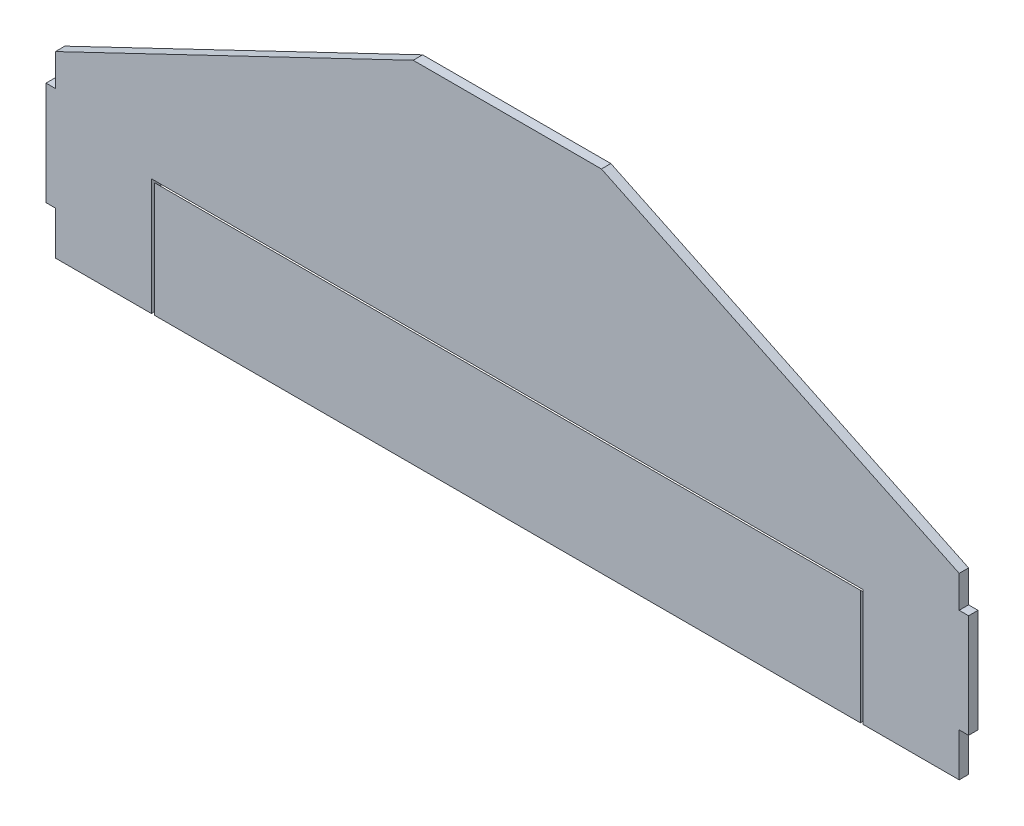
ISO-10303-21;
HEADER;
FILE_DESCRIPTION(('STEP AP214'),'2;1');
FILE_NAME('part.step','',(''),(''),'','','');
FILE_SCHEMA(('AUTOMOTIVE_DESIGN { 1 0 10303 214 1 1 1 1 }'));
ENDSEC;
DATA;
#1=APPLICATION_CONTEXT('core data for automotive mechanical design processes');
#2=APPLICATION_PROTOCOL_DEFINITION('international standard','automotive_design',2000,#1);
#3=PRODUCT_CONTEXT('',#1,'mechanical');
#4=PRODUCT('Part','Part','',(#3));
#5=PRODUCT_RELATED_PRODUCT_CATEGORY('part','',(#4));
#6=PRODUCT_DEFINITION_FORMATION('','',#4);
#7=PRODUCT_DEFINITION_CONTEXT('part definition',#1,'design');
#8=PRODUCT_DEFINITION('design','',#6,#7);
#9=PRODUCT_DEFINITION_SHAPE('','',#8);
#10=(LENGTH_UNIT() NAMED_UNIT(*) SI_UNIT(.MILLI.,.METRE.));
#11=(NAMED_UNIT(*) PLANE_ANGLE_UNIT() SI_UNIT($,.RADIAN.));
#12=(NAMED_UNIT(*) SI_UNIT($,.STERADIAN.) SOLID_ANGLE_UNIT());
#13=UNCERTAINTY_MEASURE_WITH_UNIT(LENGTH_MEASURE(1.E-05),#10,'distance_accuracy_value','');
#14=(GEOMETRIC_REPRESENTATION_CONTEXT(3) GLOBAL_UNCERTAINTY_ASSIGNED_CONTEXT((#13)) GLOBAL_UNIT_ASSIGNED_CONTEXT((#10,
#11,#12)) REPRESENTATION_CONTEXT('',''));
#15=CARTESIAN_POINT('',(0.,0.,0.));
#16=DIRECTION('',(0.,0.,1.));
#17=DIRECTION('',(1.,0.,0.));
#18=AXIS2_PLACEMENT_3D('',#15,#16,#17);
#19=CARTESIAN_POINT('',(240.,0.,5.));
#20=DIRECTION('',(0.,1.,0.));
#21=DIRECTION('',(0.,0.,1.));
#22=AXIS2_PLACEMENT_3D('',#19,#20,#21);
#23=PLANE('',#22);
#24=DIRECTION('',(1.,0.,0.));
#25=VECTOR('',#24,1.);
#26=CARTESIAN_POINT('',(240.,0.,5.));
#27=LINE('',#26,#25);
#28=CARTESIAN_POINT('',(189.,0.,5.));
#29=VERTEX_POINT('',#28);
#30=CARTESIAN_POINT('',(240.,0.,5.));
#31=VERTEX_POINT('',#30);
#32=EDGE_CURVE('E232',#29,#31,#27,.T.);
#33=ORIENTED_EDGE('',*,*,#32,.F.);
#34=DIRECTION('',(0.,0.,1.));
#35=VECTOR('',#34,1.);
#36=CARTESIAN_POINT('',(189.,0.,0.));
#37=LINE('',#36,#35);
#38=CARTESIAN_POINT('',(189.,0.,0.));
#39=VERTEX_POINT('',#38);
#40=EDGE_CURVE('E12',#39,#29,#37,.T.);
#41=ORIENTED_EDGE('',*,*,#40,.F.);
#42=DIRECTION('',(1.,0.,0.));
#43=VECTOR('',#42,1.);
#44=CARTESIAN_POINT('',(240.,0.,0.));
#45=LINE('',#44,#43);
#46=CARTESIAN_POINT('',(240.,0.,0.));
#47=VERTEX_POINT('',#46);
#48=EDGE_CURVE('E278',#39,#47,#45,.T.);
#49=ORIENTED_EDGE('',*,*,#48,.T.);
#50=DIRECTION('',(0.,0.,-1.));
#51=VECTOR('',#50,1.);
#52=CARTESIAN_POINT('',(240.,0.,5.));
#53=LINE('',#52,#51);
#54=EDGE_CURVE('E244',#31,#47,#53,.T.);
#55=ORIENTED_EDGE('',*,*,#54,.F.);
#56=EDGE_LOOP('',(#33,#41,#49,#55));
#57=FACE_BOUND('',#56,.T.);
#58=ADVANCED_FACE('F43',(#57),#23,.F.);
#59=CARTESIAN_POINT('',(-240.,0.,0.));
#60=VERTEX_POINT('',#59);
#61=CARTESIAN_POINT('',(-189.,0.,0.));
#62=VERTEX_POINT('',#61);
#63=EDGE_CURVE('E46',#60,#62,#45,.T.);
#64=ORIENTED_EDGE('',*,*,#63,.T.);
#65=DIRECTION('',(0.,0.,1.));
#66=VECTOR('',#65,1.);
#67=CARTESIAN_POINT('',(-189.,0.,0.));
#68=LINE('',#67,#66);
#69=CARTESIAN_POINT('',(-189.,0.,5.));
#70=VERTEX_POINT('',#69);
#71=EDGE_CURVE('E213',#62,#70,#68,.T.);
#72=ORIENTED_EDGE('',*,*,#71,.T.);
#73=CARTESIAN_POINT('',(-240.,0.,5.));
#74=VERTEX_POINT('',#73);
#75=EDGE_CURVE('E231',#74,#70,#27,.T.);
#76=ORIENTED_EDGE('',*,*,#75,.F.);
#77=DIRECTION('',(0.,0.,-1.));
#78=VECTOR('',#77,1.);
#79=CARTESIAN_POINT('',(-240.,0.,5.));
#80=LINE('',#79,#78);
#81=EDGE_CURVE('E215',#74,#60,#80,.T.);
#82=ORIENTED_EDGE('',*,*,#81,.T.);
#83=EDGE_LOOP('',(#64,#72,#76,#82));
#84=FACE_BOUND('',#83,.T.);
#85=ADVANCED_FACE('F366',(#84),#23,.F.);
#86=CARTESIAN_POINT('',(0.,0.,5.));
#87=DIRECTION('',(0.,0.,-1.));
#88=DIRECTION('',(-1.,0.,0.));
#89=AXIS2_PLACEMENT_3D('',#86,#87,#88);
#90=PLANE('',#89);
#91=ORIENTED_EDGE('',*,*,#75,.T.);
#92=DIRECTION('',(0.,-1.,0.));
#93=VECTOR('',#92,1.);
#94=CARTESIAN_POINT('',(-189.,0.,5.));
#95=LINE('',#94,#93);
#96=CARTESIAN_POINT('',(-189.,62.,5.));
#97=VERTEX_POINT('',#96);
#98=EDGE_CURVE('E222',#97,#70,#95,.T.);
#99=ORIENTED_EDGE('',*,*,#98,.F.);
#100=DIRECTION('',(-1.,0.,0.));
#101=VECTOR('',#100,1.);
#102=CARTESIAN_POINT('',(-187.5,62.,5.));
#103=LINE('',#102,#101);
#104=CARTESIAN_POINT('',(189.,62.,5.));
#105=VERTEX_POINT('',#104);
#106=EDGE_CURVE('E220',#105,#97,#103,.T.);
#107=ORIENTED_EDGE('',*,*,#106,.F.);
#108=DIRECTION('',(0.,1.,0.));
#109=VECTOR('',#108,1.);
#110=CARTESIAN_POINT('',(189.,0.,5.));
#111=LINE('',#110,#109);
#112=EDGE_CURVE('E52',#29,#105,#111,.T.);
#113=ORIENTED_EDGE('',*,*,#112,.F.);
#114=ORIENTED_EDGE('',*,*,#32,.T.);
#115=DIRECTION('',(0.,1.,0.));
#116=VECTOR('',#115,1.);
#117=CARTESIAN_POINT('',(240.,0.,5.));
#118=LINE('',#117,#116);
#119=CARTESIAN_POINT('',(240.,23.,5.));
#120=VERTEX_POINT('',#119);
#121=EDGE_CURVE('E235',#31,#120,#118,.T.);
#122=ORIENTED_EDGE('',*,*,#121,.T.);
#123=DIRECTION('',(1.,0.,0.));
#124=VECTOR('',#123,1.);
#125=CARTESIAN_POINT('',(240.,23.,5.));
#126=LINE('',#125,#124);
#127=CARTESIAN_POINT('',(245.,23.,5.));
#128=VERTEX_POINT('',#127);
#129=EDGE_CURVE('E297',#120,#128,#126,.T.);
#130=ORIENTED_EDGE('',*,*,#129,.T.);
#131=DIRECTION('',(0.,1.,0.));
#132=VECTOR('',#131,1.);
#133=CARTESIAN_POINT('',(245.,78.,5.));
#134=LINE('',#133,#132);
#135=CARTESIAN_POINT('',(245.,78.,5.));
#136=VERTEX_POINT('',#135);
#137=EDGE_CURVE('E301',#128,#136,#134,.T.);
#138=ORIENTED_EDGE('',*,*,#137,.T.);
#139=DIRECTION('',(-1.,0.,0.));
#140=VECTOR('',#139,1.);
#141=CARTESIAN_POINT('',(240.,78.,5.));
#142=LINE('',#141,#140);
#143=CARTESIAN_POINT('',(240.,78.,5.));
#144=VERTEX_POINT('',#143);
#145=EDGE_CURVE('E305',#136,#144,#142,.T.);
#146=ORIENTED_EDGE('',*,*,#145,.T.);
#147=CARTESIAN_POINT('',(240.,95.,5.));
#148=VERTEX_POINT('',#147);
#149=EDGE_CURVE('E300',#144,#148,#118,.T.);
#150=ORIENTED_EDGE('',*,*,#149,.T.);
#151=DIRECTION('',(-0.90189308923433,0.431959321685916,0.));
#152=VECTOR('',#151,1.);
#153=CARTESIAN_POINT('',(240.,95.,5.));
#154=LINE('',#153,#152);
#155=CARTESIAN_POINT('',(50.,186.,5.));
#156=VERTEX_POINT('',#155);
#157=EDGE_CURVE('E304',#148,#156,#154,.T.);
#158=ORIENTED_EDGE('',*,*,#157,.T.);
#159=DIRECTION('',(-1.,0.,0.));
#160=VECTOR('',#159,1.);
#161=CARTESIAN_POINT('',(-50.,186.,5.));
#162=LINE('',#161,#160);
#163=CARTESIAN_POINT('',(-50.,186.,5.));
#164=VERTEX_POINT('',#163);
#165=EDGE_CURVE('E198',#156,#164,#162,.T.);
#166=ORIENTED_EDGE('',*,*,#165,.T.);
#167=DIRECTION('',(-0.90189308923433,-0.431959321685916,0.));
#168=VECTOR('',#167,1.);
#169=CARTESIAN_POINT('',(-240.,95.,5.));
#170=LINE('',#169,#168);
#171=CARTESIAN_POINT('',(-240.,95.,5.));
#172=VERTEX_POINT('',#171);
#173=EDGE_CURVE('E194',#164,#172,#170,.T.);
#174=ORIENTED_EDGE('',*,*,#173,.T.);
#175=DIRECTION('',(0.,-1.,0.));
#176=VECTOR('',#175,1.);
#177=CARTESIAN_POINT('',(-240.,0.,5.));
#178=LINE('',#177,#176);
#179=CARTESIAN_POINT('',(-240.,78.,5.));
#180=VERTEX_POINT('',#179);
#181=EDGE_CURVE('E181',#172,#180,#178,.T.);
#182=ORIENTED_EDGE('',*,*,#181,.T.);
#183=DIRECTION('',(-1.,0.,0.));
#184=VECTOR('',#183,1.);
#185=CARTESIAN_POINT('',(-240.,78.,5.));
#186=LINE('',#185,#184);
#187=CARTESIAN_POINT('',(-245.,78.,5.));
#188=VERTEX_POINT('',#187);
#189=EDGE_CURVE('E168',#180,#188,#186,.T.);
#190=ORIENTED_EDGE('',*,*,#189,.T.);
#191=DIRECTION('',(0.,-1.,0.));
#192=VECTOR('',#191,1.);
#193=CARTESIAN_POINT('',(-245.,78.,5.));
#194=LINE('',#193,#192);
#195=CARTESIAN_POINT('',(-245.,23.,5.));
#196=VERTEX_POINT('',#195);
#197=EDGE_CURVE('E180',#188,#196,#194,.T.);
#198=ORIENTED_EDGE('',*,*,#197,.T.);
#199=DIRECTION('',(1.,0.,0.));
#200=VECTOR('',#199,1.);
#201=CARTESIAN_POINT('',(-240.,23.,5.));
#202=LINE('',#201,#200);
#203=CARTESIAN_POINT('',(-240.,23.,5.));
#204=VERTEX_POINT('',#203);
#205=EDGE_CURVE('E202',#196,#204,#202,.T.);
#206=ORIENTED_EDGE('',*,*,#205,.T.);
#207=EDGE_CURVE('E197',#204,#74,#178,.T.);
#208=ORIENTED_EDGE('',*,*,#207,.T.);
#209=EDGE_LOOP('',(#91,#99,#107,#113,#114,#122,#130,#138,#146,#150,#158,#166,#174,#182,#190,
#198,#206,#208));
#210=FACE_BOUND('',#209,.T.);
#211=ADVANCED_FACE('F192',(#210),#90,.F.);
#212=CARTESIAN_POINT('',(0.,0.,0.));
#213=DIRECTION('',(0.,0.,-1.));
#214=DIRECTION('',(-1.,0.,0.));
#215=AXIS2_PLACEMENT_3D('',#212,#213,#214);
#216=PLANE('',#215);
#217=DIRECTION('',(0.,-1.,0.));
#218=VECTOR('',#217,1.);
#219=CARTESIAN_POINT('',(-189.,0.,0.));
#220=LINE('',#219,#218);
#221=CARTESIAN_POINT('',(-189.,62.,0.));
#222=VERTEX_POINT('',#221);
#223=EDGE_CURVE('E201',#222,#62,#220,.T.);
#224=ORIENTED_EDGE('',*,*,#223,.T.);
#225=ORIENTED_EDGE('',*,*,#63,.F.);
#226=DIRECTION('',(0.,-1.,0.));
#227=VECTOR('',#226,1.);
#228=CARTESIAN_POINT('',(-240.,0.,0.));
#229=LINE('',#228,#227);
#230=CARTESIAN_POINT('',(-240.,23.,0.));
#231=VERTEX_POINT('',#230);
#232=EDGE_CURVE('E229',#231,#60,#229,.T.);
#233=ORIENTED_EDGE('',*,*,#232,.F.);
#234=DIRECTION('',(1.,0.,0.));
#235=VECTOR('',#234,1.);
#236=CARTESIAN_POINT('',(-240.,23.,0.));
#237=LINE('',#236,#235);
#238=CARTESIAN_POINT('',(-245.,23.,0.));
#239=VERTEX_POINT('',#238);
#240=EDGE_CURVE('E276',#239,#231,#237,.T.);
#241=ORIENTED_EDGE('',*,*,#240,.F.);
#242=DIRECTION('',(0.,-1.,0.));
#243=VECTOR('',#242,1.);
#244=CARTESIAN_POINT('',(-245.,78.,0.));
#245=LINE('',#244,#243);
#246=CARTESIAN_POINT('',(-245.,78.,0.));
#247=VERTEX_POINT('',#246);
#248=EDGE_CURVE('E317',#247,#239,#245,.T.);
#249=ORIENTED_EDGE('',*,*,#248,.F.);
#250=DIRECTION('',(-1.,0.,0.));
#251=VECTOR('',#250,1.);
#252=CARTESIAN_POINT('',(-240.,78.,0.));
#253=LINE('',#252,#251);
#254=CARTESIAN_POINT('',(-240.,78.,0.));
#255=VERTEX_POINT('',#254);
#256=EDGE_CURVE('E314',#255,#247,#253,.T.);
#257=ORIENTED_EDGE('',*,*,#256,.F.);
#258=CARTESIAN_POINT('',(-240.,95.,0.));
#259=VERTEX_POINT('',#258);
#260=EDGE_CURVE('E188',#259,#255,#229,.T.);
#261=ORIENTED_EDGE('',*,*,#260,.F.);
#262=DIRECTION('',(-0.90189308923433,-0.431959321685916,0.));
#263=VECTOR('',#262,1.);
#264=CARTESIAN_POINT('',(-240.,95.,0.));
#265=LINE('',#264,#263);
#266=CARTESIAN_POINT('',(-50.,186.,0.));
#267=VERTEX_POINT('',#266);
#268=EDGE_CURVE('E251',#267,#259,#265,.T.);
#269=ORIENTED_EDGE('',*,*,#268,.F.);
#270=DIRECTION('',(-1.,0.,0.));
#271=VECTOR('',#270,1.);
#272=CARTESIAN_POINT('',(-50.,186.,0.));
#273=LINE('',#272,#271);
#274=CARTESIAN_POINT('',(50.,186.,0.));
#275=VERTEX_POINT('',#274);
#276=EDGE_CURVE('E254',#275,#267,#273,.T.);
#277=ORIENTED_EDGE('',*,*,#276,.F.);
#278=DIRECTION('',(-0.90189308923433,0.431959321685916,0.));
#279=VECTOR('',#278,1.);
#280=CARTESIAN_POINT('',(240.,95.,0.));
#281=LINE('',#280,#279);
#282=CARTESIAN_POINT('',(240.,95.,0.));
#283=VERTEX_POINT('',#282);
#284=EDGE_CURVE('E247',#283,#275,#281,.T.);
#285=ORIENTED_EDGE('',*,*,#284,.F.);
#286=DIRECTION('',(0.,1.,0.));
#287=VECTOR('',#286,1.);
#288=CARTESIAN_POINT('',(240.,0.,0.));
#289=LINE('',#288,#287);
#290=CARTESIAN_POINT('',(240.,78.,0.));
#291=VERTEX_POINT('',#290);
#292=EDGE_CURVE('E259',#291,#283,#289,.T.);
#293=ORIENTED_EDGE('',*,*,#292,.F.);
#294=DIRECTION('',(-1.,0.,0.));
#295=VECTOR('',#294,1.);
#296=CARTESIAN_POINT('',(240.,78.,0.));
#297=LINE('',#296,#295);
#298=CARTESIAN_POINT('',(245.,78.,0.));
#299=VERTEX_POINT('',#298);
#300=EDGE_CURVE('E324',#299,#291,#297,.T.);
#301=ORIENTED_EDGE('',*,*,#300,.F.);
#302=DIRECTION('',(0.,1.,0.));
#303=VECTOR('',#302,1.);
#304=CARTESIAN_POINT('',(245.,78.,0.));
#305=LINE('',#304,#303);
#306=CARTESIAN_POINT('',(245.,23.,0.));
#307=VERTEX_POINT('',#306);
#308=EDGE_CURVE('E290',#307,#299,#305,.T.);
#309=ORIENTED_EDGE('',*,*,#308,.F.);
#310=DIRECTION('',(1.,0.,0.));
#311=VECTOR('',#310,1.);
#312=CARTESIAN_POINT('',(240.,23.,0.));
#313=LINE('',#312,#311);
#314=CARTESIAN_POINT('',(240.,23.,0.));
#315=VERTEX_POINT('',#314);
#316=EDGE_CURVE('E287',#315,#307,#313,.T.);
#317=ORIENTED_EDGE('',*,*,#316,.F.);
#318=EDGE_CURVE('E257',#47,#315,#289,.T.);
#319=ORIENTED_EDGE('',*,*,#318,.F.);
#320=ORIENTED_EDGE('',*,*,#48,.F.);
#321=DIRECTION('',(0.,1.,0.));
#322=VECTOR('',#321,1.);
#323=CARTESIAN_POINT('',(189.,0.,0.));
#324=LINE('',#323,#322);
#325=CARTESIAN_POINT('',(189.,62.,0.));
#326=VERTEX_POINT('',#325);
#327=EDGE_CURVE('E207',#39,#326,#324,.T.);
#328=ORIENTED_EDGE('',*,*,#327,.T.);
#329=DIRECTION('',(-1.,0.,0.));
#330=VECTOR('',#329,1.);
#331=CARTESIAN_POINT('',(187.5,62.,0.));
#332=LINE('',#331,#330);
#333=EDGE_CURVE('E226',#326,#222,#332,.T.);
#334=ORIENTED_EDGE('',*,*,#333,.T.);
#335=EDGE_LOOP('',(#224,#225,#233,#241,#249,#257,#261,#269,#277,#285,#293,#301,#309,#317,#319,
#320,#328,#334));
#336=FACE_BOUND('',#335,.T.);
#337=ADVANCED_FACE('F275',(#336),#216,.T.);
#338=CARTESIAN_POINT('',(-240.,0.,5.));
#339=DIRECTION('',(1.,0.,0.));
#340=DIRECTION('',(0.,1.,0.));
#341=AXIS2_PLACEMENT_3D('',#338,#339,#340);
#342=PLANE('',#341);
#343=DIRECTION('',(0.,0.,1.));
#344=VECTOR('',#343,1.);
#345=CARTESIAN_POINT('',(-240.,23.,-55.2268050859363));
#346=LINE('',#345,#344);
#347=EDGE_CURVE('E273',#231,#204,#346,.T.);
#348=ORIENTED_EDGE('',*,*,#347,.F.);
#349=ORIENTED_EDGE('',*,*,#232,.T.);
#350=ORIENTED_EDGE('',*,*,#81,.F.);
#351=ORIENTED_EDGE('',*,*,#207,.F.);
#352=EDGE_LOOP('',(#348,#349,#350,#351));
#353=FACE_BOUND('',#352,.T.);
#354=ADVANCED_FACE('F272',(#353),#342,.F.);
#355=CARTESIAN_POINT('',(240.,0.,5.));
#356=DIRECTION('',(-1.,0.,0.));
#357=DIRECTION('',(0.,-1.,0.));
#358=AXIS2_PLACEMENT_3D('',#355,#356,#357);
#359=PLANE('',#358);
#360=DIRECTION('',(0.,0.,1.));
#361=VECTOR('',#360,1.);
#362=CARTESIAN_POINT('',(240.,78.,-55.2268050859363));
#363=LINE('',#362,#361);
#364=EDGE_CURVE('E322',#291,#144,#363,.T.);
#365=ORIENTED_EDGE('',*,*,#364,.F.);
#366=ORIENTED_EDGE('',*,*,#292,.T.);
#367=DIRECTION('',(0.,0.,-1.));
#368=VECTOR('',#367,1.);
#369=CARTESIAN_POINT('',(240.,95.,5.));
#370=LINE('',#369,#368);
#371=EDGE_CURVE('E256',#148,#283,#370,.T.);
#372=ORIENTED_EDGE('',*,*,#371,.F.);
#373=ORIENTED_EDGE('',*,*,#149,.F.);
#374=EDGE_LOOP('',(#365,#366,#372,#373));
#375=FACE_BOUND('',#374,.T.);
#376=ADVANCED_FACE('F337',(#375),#359,.F.);
#377=ORIENTED_EDGE('',*,*,#318,.T.);
#378=DIRECTION('',(0.,0.,1.));
#379=VECTOR('',#378,1.);
#380=CARTESIAN_POINT('',(240.,23.,-55.2268050859363));
#381=LINE('',#380,#379);
#382=EDGE_CURVE('E248',#315,#120,#381,.T.);
#383=ORIENTED_EDGE('',*,*,#382,.T.);
#384=ORIENTED_EDGE('',*,*,#121,.F.);
#385=ORIENTED_EDGE('',*,*,#54,.T.);
#386=EDGE_LOOP('',(#377,#383,#384,#385));
#387=FACE_BOUND('',#386,.T.);
#388=ADVANCED_FACE('F284',(#387),#359,.F.);
#389=CARTESIAN_POINT('',(240.,95.,5.));
#390=DIRECTION('',(-0.431959321685916,-0.90189308923433,0.));
#391=DIRECTION('',(0.90189308923433,-0.431959321685916,0.));
#392=AXIS2_PLACEMENT_3D('',#389,#390,#391);
#393=PLANE('',#392);
#394=ORIENTED_EDGE('',*,*,#284,.T.);
#395=DIRECTION('',(0.,0.,-1.));
#396=VECTOR('',#395,1.);
#397=CARTESIAN_POINT('',(50.,186.,5.));
#398=LINE('',#397,#396);
#399=EDGE_CURVE('E253',#156,#275,#398,.T.);
#400=ORIENTED_EDGE('',*,*,#399,.F.);
#401=ORIENTED_EDGE('',*,*,#157,.F.);
#402=ORIENTED_EDGE('',*,*,#371,.T.);
#403=EDGE_LOOP('',(#394,#400,#401,#402));
#404=FACE_BOUND('',#403,.T.);
#405=ADVANCED_FACE('F344',(#404),#393,.F.);
#406=CARTESIAN_POINT('',(-50.,186.,5.));
#407=DIRECTION('',(0.,-1.,0.));
#408=DIRECTION('',(0.,0.,-1.));
#409=AXIS2_PLACEMENT_3D('',#406,#407,#408);
#410=PLANE('',#409);
#411=ORIENTED_EDGE('',*,*,#276,.T.);
#412=DIRECTION('',(0.,0.,-1.));
#413=VECTOR('',#412,1.);
#414=CARTESIAN_POINT('',(-50.,186.,5.));
#415=LINE('',#414,#413);
#416=EDGE_CURVE('E250',#164,#267,#415,.T.);
#417=ORIENTED_EDGE('',*,*,#416,.F.);
#418=ORIENTED_EDGE('',*,*,#165,.F.);
#419=ORIENTED_EDGE('',*,*,#399,.T.);
#420=EDGE_LOOP('',(#411,#417,#418,#419));
#421=FACE_BOUND('',#420,.T.);
#422=ADVANCED_FACE('F460',(#421),#410,.F.);
#423=CARTESIAN_POINT('',(-240.,95.,5.));
#424=DIRECTION('',(0.431959321685916,-0.90189308923433,0.));
#425=DIRECTION('',(0.90189308923433,0.431959321685916,0.));
#426=AXIS2_PLACEMENT_3D('',#423,#424,#425);
#427=PLANE('',#426);
#428=ORIENTED_EDGE('',*,*,#268,.T.);
#429=DIRECTION('',(0.,0.,-1.));
#430=VECTOR('',#429,1.);
#431=CARTESIAN_POINT('',(-240.,95.,5.));
#432=LINE('',#431,#430);
#433=EDGE_CURVE('E189',#172,#259,#432,.T.);
#434=ORIENTED_EDGE('',*,*,#433,.F.);
#435=ORIENTED_EDGE('',*,*,#173,.F.);
#436=ORIENTED_EDGE('',*,*,#416,.T.);
#437=EDGE_LOOP('',(#428,#434,#435,#436));
#438=FACE_BOUND('',#437,.T.);
#439=ADVANCED_FACE('F350',(#438),#427,.F.);
#440=ORIENTED_EDGE('',*,*,#260,.T.);
#441=DIRECTION('',(0.,0.,1.));
#442=VECTOR('',#441,1.);
#443=CARTESIAN_POINT('',(-240.,78.,-55.2268050859363));
#444=LINE('',#443,#442);
#445=EDGE_CURVE('E172',#255,#180,#444,.T.);
#446=ORIENTED_EDGE('',*,*,#445,.T.);
#447=ORIENTED_EDGE('',*,*,#181,.F.);
#448=ORIENTED_EDGE('',*,*,#433,.T.);
#449=EDGE_LOOP('',(#440,#446,#447,#448));
#450=FACE_BOUND('',#449,.T.);
#451=ADVANCED_FACE('F185',(#450),#342,.F.);
#452=CARTESIAN_POINT('',(240.,23.,-55.2268050859363));
#453=DIRECTION('',(0.,-1.,0.));
#454=DIRECTION('',(0.,0.,-1.));
#455=AXIS2_PLACEMENT_3D('',#452,#453,#454);
#456=PLANE('',#455);
#457=ORIENTED_EDGE('',*,*,#382,.F.);
#458=ORIENTED_EDGE('',*,*,#316,.T.);
#459=DIRECTION('',(0.,0.,1.));
#460=VECTOR('',#459,1.);
#461=CARTESIAN_POINT('',(245.,23.,-55.2268050859363));
#462=LINE('',#461,#460);
#463=EDGE_CURVE('E293',#307,#128,#462,.T.);
#464=ORIENTED_EDGE('',*,*,#463,.T.);
#465=ORIENTED_EDGE('',*,*,#129,.F.);
#466=EDGE_LOOP('',(#457,#458,#464,#465));
#467=FACE_BOUND('',#466,.T.);
#468=ADVANCED_FACE('F295',(#467),#456,.T.);
#469=CARTESIAN_POINT('',(245.,78.,-55.2268050859363));
#470=DIRECTION('',(1.,0.,0.));
#471=DIRECTION('',(0.,0.,-1.));
#472=AXIS2_PLACEMENT_3D('',#469,#470,#471);
#473=PLANE('',#472);
#474=ORIENTED_EDGE('',*,*,#463,.F.);
#475=ORIENTED_EDGE('',*,*,#308,.T.);
#476=DIRECTION('',(0.,0.,1.));
#477=VECTOR('',#476,1.);
#478=CARTESIAN_POINT('',(245.,78.,-55.2268050859363));
#479=LINE('',#478,#477);
#480=EDGE_CURVE('E327',#299,#136,#479,.T.);
#481=ORIENTED_EDGE('',*,*,#480,.T.);
#482=ORIENTED_EDGE('',*,*,#137,.F.);
#483=EDGE_LOOP('',(#474,#475,#481,#482));
#484=FACE_BOUND('',#483,.T.);
#485=ADVANCED_FACE('F334',(#484),#473,.T.);
#486=CARTESIAN_POINT('',(240.,78.,-55.2268050859363));
#487=DIRECTION('',(0.,1.,0.));
#488=DIRECTION('',(0.,0.,1.));
#489=AXIS2_PLACEMENT_3D('',#486,#487,#488);
#490=PLANE('',#489);
#491=ORIENTED_EDGE('',*,*,#480,.F.);
#492=ORIENTED_EDGE('',*,*,#300,.T.);
#493=ORIENTED_EDGE('',*,*,#364,.T.);
#494=ORIENTED_EDGE('',*,*,#145,.F.);
#495=EDGE_LOOP('',(#491,#492,#493,#494));
#496=FACE_BOUND('',#495,.T.);
#497=ADVANCED_FACE('F336',(#496),#490,.T.);
#498=CARTESIAN_POINT('',(-245.,78.,-55.2268050859363));
#499=DIRECTION('',(-1.,0.,0.));
#500=DIRECTION('',(0.,0.,1.));
#501=AXIS2_PLACEMENT_3D('',#498,#499,#500);
#502=PLANE('',#501);
#503=DIRECTION('',(0.,0.,1.));
#504=VECTOR('',#503,1.);
#505=CARTESIAN_POINT('',(-245.,78.,-55.2268050859363));
#506=LINE('',#505,#504);
#507=EDGE_CURVE('E175',#247,#188,#506,.T.);
#508=ORIENTED_EDGE('',*,*,#507,.F.);
#509=ORIENTED_EDGE('',*,*,#248,.T.);
#510=DIRECTION('',(0.,0.,1.));
#511=VECTOR('',#510,1.);
#512=CARTESIAN_POINT('',(-245.,23.,-55.2268050859363));
#513=LINE('',#512,#511);
#514=EDGE_CURVE('E315',#239,#196,#513,.T.);
#515=ORIENTED_EDGE('',*,*,#514,.T.);
#516=ORIENTED_EDGE('',*,*,#197,.F.);
#517=EDGE_LOOP('',(#508,#509,#515,#516));
#518=FACE_BOUND('',#517,.T.);
#519=ADVANCED_FACE('F353',(#518),#502,.T.);
#520=CARTESIAN_POINT('',(-240.,23.,-55.2268050859363));
#521=DIRECTION('',(0.,-1.,0.));
#522=DIRECTION('',(0.,0.,-1.));
#523=AXIS2_PLACEMENT_3D('',#520,#521,#522);
#524=PLANE('',#523);
#525=ORIENTED_EDGE('',*,*,#514,.F.);
#526=ORIENTED_EDGE('',*,*,#240,.T.);
#527=ORIENTED_EDGE('',*,*,#347,.T.);
#528=ORIENTED_EDGE('',*,*,#205,.F.);
#529=EDGE_LOOP('',(#525,#526,#527,#528));
#530=FACE_BOUND('',#529,.T.);
#531=ADVANCED_FACE('F355',(#530),#524,.T.);
#532=CARTESIAN_POINT('',(-240.,78.,-55.2268050859363));
#533=DIRECTION('',(0.,1.,0.));
#534=DIRECTION('',(0.,0.,1.));
#535=AXIS2_PLACEMENT_3D('',#532,#533,#534);
#536=PLANE('',#535);
#537=ORIENTED_EDGE('',*,*,#445,.F.);
#538=ORIENTED_EDGE('',*,*,#256,.T.);
#539=ORIENTED_EDGE('',*,*,#507,.T.);
#540=ORIENTED_EDGE('',*,*,#189,.F.);
#541=EDGE_LOOP('',(#537,#538,#539,#540));
#542=FACE_BOUND('',#541,.T.);
#543=ADVANCED_FACE('F170',(#542),#536,.T.);
#544=CARTESIAN_POINT('',(-189.,0.,0.));
#545=DIRECTION('',(-1.,0.,0.));
#546=DIRECTION('',(0.,0.,1.));
#547=AXIS2_PLACEMENT_3D('',#544,#545,#546);
#548=PLANE('',#547);
#549=ORIENTED_EDGE('',*,*,#98,.T.);
#550=ORIENTED_EDGE('',*,*,#71,.F.);
#551=ORIENTED_EDGE('',*,*,#223,.F.);
#552=DIRECTION('',(0.,0.,1.));
#553=VECTOR('',#552,1.);
#554=CARTESIAN_POINT('',(-189.,62.,0.));
#555=LINE('',#554,#553);
#556=EDGE_CURVE('E77',#222,#97,#555,.T.);
#557=ORIENTED_EDGE('',*,*,#556,.T.);
#558=EDGE_LOOP('',(#549,#550,#551,#557));
#559=FACE_BOUND('',#558,.T.);
#560=ADVANCED_FACE('F362',(#559),#548,.F.);
#561=CARTESIAN_POINT('',(-187.5,62.,0.));
#562=DIRECTION('',(0.,1.,0.));
#563=DIRECTION('',(0.,0.,1.));
#564=AXIS2_PLACEMENT_3D('',#561,#562,#563);
#565=PLANE('',#564);
#566=ORIENTED_EDGE('',*,*,#106,.T.);
#567=ORIENTED_EDGE('',*,*,#556,.F.);
#568=ORIENTED_EDGE('',*,*,#333,.F.);
#569=DIRECTION('',(0.,0.,1.));
#570=VECTOR('',#569,1.);
#571=CARTESIAN_POINT('',(189.,62.,0.));
#572=LINE('',#571,#570);
#573=EDGE_CURVE('E217',#326,#105,#572,.T.);
#574=ORIENTED_EDGE('',*,*,#573,.T.);
#575=EDGE_LOOP('',(#566,#567,#568,#574));
#576=FACE_BOUND('',#575,.T.);
#577=ADVANCED_FACE('F378',(#576),#565,.F.);
#578=CARTESIAN_POINT('',(189.,0.,0.));
#579=DIRECTION('',(1.,0.,0.));
#580=DIRECTION('',(0.,0.,-1.));
#581=AXIS2_PLACEMENT_3D('',#578,#579,#580);
#582=PLANE('',#581);
#583=ORIENTED_EDGE('',*,*,#112,.T.);
#584=ORIENTED_EDGE('',*,*,#573,.F.);
#585=ORIENTED_EDGE('',*,*,#327,.F.);
#586=ORIENTED_EDGE('',*,*,#40,.T.);
#587=EDGE_LOOP('',(#583,#584,#585,#586));
#588=FACE_BOUND('',#587,.T.);
#589=ADVANCED_FACE('F381',(#588),#582,.F.);
#590=CLOSED_SHELL('',(#58,#85,#211,#337,#354,#376,#388,#405,#422,#439,#451,#468,#485,#497,#519,
#531,#543,#560,#577,#589));
#591=MANIFOLD_SOLID_BREP('B2',#590);
#592=CARTESIAN_POINT('',(0.,0.,5.));
#593=DIRECTION('',(0.,0.,-1.));
#594=DIRECTION('',(-1.,0.,0.));
#595=AXIS2_PLACEMENT_3D('',#592,#593,#594);
#596=PLANE('',#595);
#597=DIRECTION('',(1.,0.,0.));
#598=VECTOR('',#597,1.);
#599=CARTESIAN_POINT('',(240.,0.,5.));
#600=LINE('',#599,#598);
#601=CARTESIAN_POINT('',(-187.5,0.,5.));
#602=VERTEX_POINT('',#601);
#603=CARTESIAN_POINT('',(187.5,0.,5.));
#604=VERTEX_POINT('',#603);
#605=EDGE_CURVE('E593',#602,#604,#600,.T.);
#606=ORIENTED_EDGE('',*,*,#605,.T.);
#607=DIRECTION('',(0.,-1.,0.));
#608=VECTOR('',#607,1.);
#609=CARTESIAN_POINT('',(187.5,0.,5.));
#610=LINE('',#609,#608);
#611=CARTESIAN_POINT('',(187.5,61.,5.));
#612=VERTEX_POINT('',#611);
#613=EDGE_CURVE('E584',#612,#604,#610,.T.);
#614=ORIENTED_EDGE('',*,*,#613,.F.);
#615=DIRECTION('',(1.,0.,0.));
#616=VECTOR('',#615,1.);
#617=CARTESIAN_POINT('',(-187.5,61.,5.));
#618=LINE('',#617,#616);
#619=CARTESIAN_POINT('',(-187.5,61.,5.));
#620=VERTEX_POINT('',#619);
#621=EDGE_CURVE('E609',#620,#612,#618,.T.);
#622=ORIENTED_EDGE('',*,*,#621,.F.);
#623=DIRECTION('',(0.,1.,0.));
#624=VECTOR('',#623,1.);
#625=CARTESIAN_POINT('',(-187.5,0.,5.));
#626=LINE('',#625,#624);
#627=EDGE_CURVE('E611',#602,#620,#626,.T.);
#628=ORIENTED_EDGE('',*,*,#627,.F.);
#629=EDGE_LOOP('',(#606,#614,#622,#628));
#630=FACE_BOUND('',#629,.T.);
#631=ADVANCED_FACE('F540',(#630),#596,.F.);
#632=CARTESIAN_POINT('',(0.,0.,0.));
#633=DIRECTION('',(0.,0.,-1.));
#634=DIRECTION('',(-1.,0.,0.));
#635=AXIS2_PLACEMENT_3D('',#632,#633,#634);
#636=PLANE('',#635);
#637=DIRECTION('',(0.,1.,0.));
#638=VECTOR('',#637,1.);
#639=CARTESIAN_POINT('',(-187.5,0.,0.));
#640=LINE('',#639,#638);
#641=CARTESIAN_POINT('',(-187.5,0.,0.));
#642=VERTEX_POINT('',#641);
#643=CARTESIAN_POINT('',(-187.5,56.,0.));
#644=VERTEX_POINT('',#643);
#645=EDGE_CURVE('E576',#642,#644,#640,.T.);
#646=ORIENTED_EDGE('',*,*,#645,.T.);
#647=DIRECTION('',(1.,0.,0.));
#648=VECTOR('',#647,1.);
#649=CARTESIAN_POINT('',(187.5,56.,0.));
#650=LINE('',#649,#648);
#651=CARTESIAN_POINT('',(187.5,56.,0.));
#652=VERTEX_POINT('',#651);
#653=EDGE_CURVE('E600',#644,#652,#650,.T.);
#654=ORIENTED_EDGE('',*,*,#653,.T.);
#655=DIRECTION('',(0.,-1.,0.));
#656=VECTOR('',#655,1.);
#657=CARTESIAN_POINT('',(187.5,0.,0.));
#658=LINE('',#657,#656);
#659=CARTESIAN_POINT('',(187.5,0.,0.));
#660=VERTEX_POINT('',#659);
#661=EDGE_CURVE('E583',#652,#660,#658,.T.);
#662=ORIENTED_EDGE('',*,*,#661,.T.);
#663=DIRECTION('',(1.,0.,0.));
#664=VECTOR('',#663,1.);
#665=CARTESIAN_POINT('',(240.,0.,0.));
#666=LINE('',#665,#664);
#667=EDGE_CURVE('E591',#642,#660,#666,.T.);
#668=ORIENTED_EDGE('',*,*,#667,.F.);
#669=EDGE_LOOP('',(#646,#654,#662,#668));
#670=FACE_BOUND('',#669,.T.);
#671=ADVANCED_FACE('F596',(#670),#636,.T.);
#672=CARTESIAN_POINT('',(240.,0.,5.));
#673=DIRECTION('',(0.,1.,0.));
#674=DIRECTION('',(0.,0.,1.));
#675=AXIS2_PLACEMENT_3D('',#672,#673,#674);
#676=PLANE('',#675);
#677=ORIENTED_EDGE('',*,*,#667,.T.);
#678=DIRECTION('',(0.,0.,1.));
#679=VECTOR('',#678,1.);
#680=CARTESIAN_POINT('',(187.5,0.,0.));
#681=LINE('',#680,#679);
#682=EDGE_CURVE('E594',#660,#604,#681,.T.);
#683=ORIENTED_EDGE('',*,*,#682,.T.);
#684=ORIENTED_EDGE('',*,*,#605,.F.);
#685=DIRECTION('',(0.,0.,1.));
#686=VECTOR('',#685,1.);
#687=CARTESIAN_POINT('',(-187.5,0.,0.));
#688=LINE('',#687,#686);
#689=EDGE_CURVE('E579',#642,#602,#688,.T.);
#690=ORIENTED_EDGE('',*,*,#689,.F.);
#691=EDGE_LOOP('',(#677,#683,#684,#690));
#692=FACE_BOUND('',#691,.T.);
#693=ADVANCED_FACE('F589',(#692),#676,.F.);
#694=CARTESIAN_POINT('',(-187.5,0.,0.));
#695=DIRECTION('',(1.,0.,0.));
#696=DIRECTION('',(0.,0.,-1.));
#697=AXIS2_PLACEMENT_3D('',#694,#695,#696);
#698=PLANE('',#697);
#699=ORIENTED_EDGE('',*,*,#627,.T.);
#700=DIRECTION('',(0.,-0.707106781186544,-0.707106781186551));
#701=VECTOR('',#700,1.);
#702=CARTESIAN_POINT('',(-187.5,56.,0.));
#703=LINE('',#702,#701);
#704=EDGE_CURVE('E41',#620,#644,#703,.T.);
#705=ORIENTED_EDGE('',*,*,#704,.T.);
#706=ORIENTED_EDGE('',*,*,#645,.F.);
#707=ORIENTED_EDGE('',*,*,#689,.T.);
#708=EDGE_LOOP('',(#699,#705,#706,#707));
#709=FACE_BOUND('',#708,.T.);
#710=ADVANCED_FACE('F578',(#709),#698,.F.);
#711=CARTESIAN_POINT('',(187.5,0.,0.));
#712=DIRECTION('',(-1.,0.,0.));
#713=DIRECTION('',(0.,0.,1.));
#714=AXIS2_PLACEMENT_3D('',#711,#712,#713);
#715=PLANE('',#714);
#716=ORIENTED_EDGE('',*,*,#661,.F.);
#717=DIRECTION('',(0.,0.707106781186544,0.707106781186551));
#718=VECTOR('',#717,1.);
#719=CARTESIAN_POINT('',(187.5,56.,0.));
#720=LINE('',#719,#718);
#721=EDGE_CURVE('E548',#652,#612,#720,.T.);
#722=ORIENTED_EDGE('',*,*,#721,.T.);
#723=ORIENTED_EDGE('',*,*,#613,.T.);
#724=ORIENTED_EDGE('',*,*,#682,.F.);
#725=EDGE_LOOP('',(#716,#722,#723,#724));
#726=FACE_BOUND('',#725,.T.);
#727=ADVANCED_FACE('F606',(#726),#715,.F.);
#728=CARTESIAN_POINT('',(0.,56.,0.));
#729=DIRECTION('',(0.,0.707106781186551,-0.707106781186543));
#730=DIRECTION('',(-1.,0.,0.));
#731=AXIS2_PLACEMENT_3D('',#728,#729,#730);
#732=PLANE('',#731);
#733=ORIENTED_EDGE('',*,*,#704,.F.);
#734=ORIENTED_EDGE('',*,*,#621,.T.);
#735=ORIENTED_EDGE('',*,*,#721,.F.);
#736=ORIENTED_EDGE('',*,*,#653,.F.);
#737=EDGE_LOOP('',(#733,#734,#735,#736));
#738=FACE_BOUND('',#737,.T.);
#739=ADVANCED_FACE('F542',(#738),#732,.T.);
#740=CLOSED_SHELL('',(#631,#671,#693,#710,#727,#739));
#741=MANIFOLD_SOLID_BREP('B6',#740);
#742=ADVANCED_BREP_SHAPE_REPRESENTATION('',(#18,#591,#741),#14);
#743=SHAPE_DEFINITION_REPRESENTATION(#9,#742);
ENDSEC;
END-ISO-10303-21;
